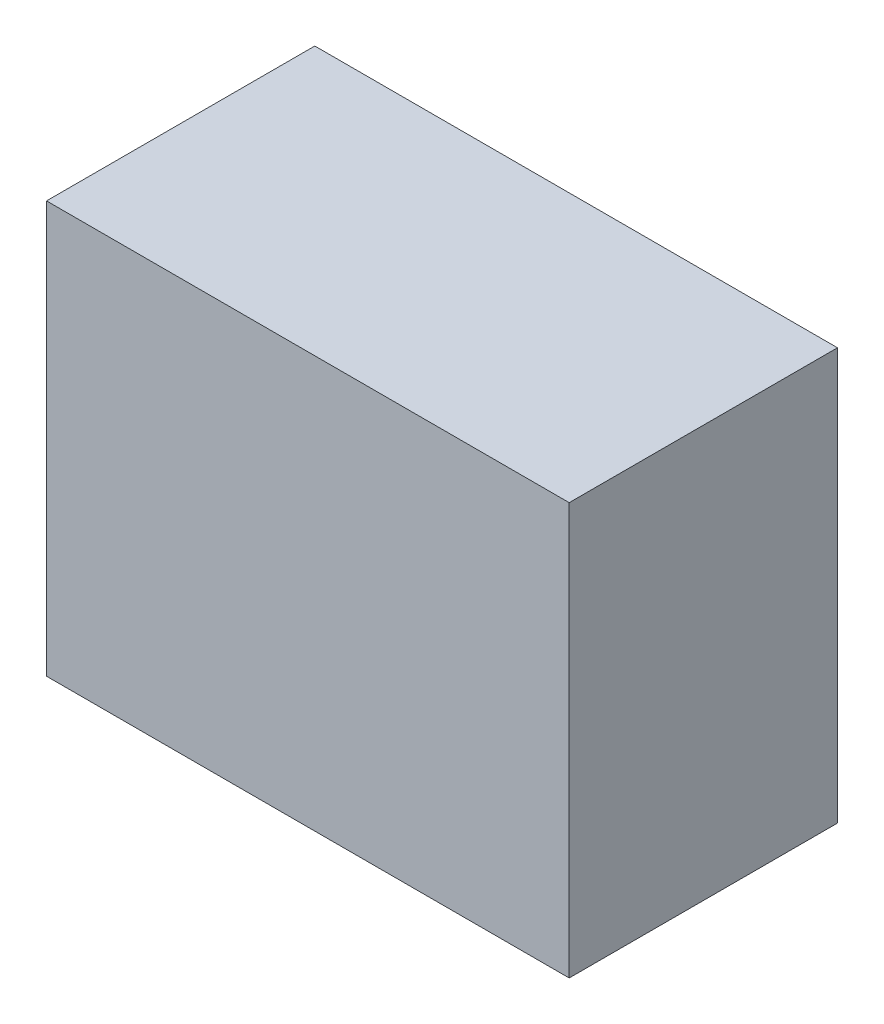
ISO-10303-21;
HEADER;
FILE_DESCRIPTION(('STEP AP214'),'2;1');
FILE_NAME('part.step','',(''),(''),'','','');
FILE_SCHEMA(('AUTOMOTIVE_DESIGN { 1 0 10303 214 1 1 1 1 }'));
ENDSEC;
DATA;
#1=APPLICATION_CONTEXT('core data for automotive mechanical design processes');
#2=APPLICATION_PROTOCOL_DEFINITION('international standard','automotive_design',2000,#1);
#3=PRODUCT_CONTEXT('',#1,'mechanical');
#4=PRODUCT('Part','Part','',(#3));
#5=PRODUCT_RELATED_PRODUCT_CATEGORY('part','',(#4));
#6=PRODUCT_DEFINITION_FORMATION('','',#4);
#7=PRODUCT_DEFINITION_CONTEXT('part definition',#1,'design');
#8=PRODUCT_DEFINITION('design','',#6,#7);
#9=PRODUCT_DEFINITION_SHAPE('','',#8);
#10=(LENGTH_UNIT() NAMED_UNIT(*) SI_UNIT(.MILLI.,.METRE.));
#11=(NAMED_UNIT(*) PLANE_ANGLE_UNIT() SI_UNIT($,.RADIAN.));
#12=(NAMED_UNIT(*) SI_UNIT($,.STERADIAN.) SOLID_ANGLE_UNIT());
#13=UNCERTAINTY_MEASURE_WITH_UNIT(LENGTH_MEASURE(1.E-05),#10,'distance_accuracy_value','');
#14=(GEOMETRIC_REPRESENTATION_CONTEXT(3) GLOBAL_UNCERTAINTY_ASSIGNED_CONTEXT((#13)) GLOBAL_UNIT_ASSIGNED_CONTEXT((#10,
#11,#12)) REPRESENTATION_CONTEXT('',''));
#15=CARTESIAN_POINT('',(0.,0.,0.));
#16=DIRECTION('',(0.,0.,1.));
#17=DIRECTION('',(1.,0.,0.));
#18=AXIS2_PLACEMENT_3D('',#15,#16,#17);
#19=CARTESIAN_POINT('',(-56.5,89.,29.));
#20=DIRECTION('',(-1.,0.,0.));
#21=DIRECTION('',(0.,0.,1.));
#22=AXIS2_PLACEMENT_3D('',#19,#20,#21);
#23=PLANE('',#22);
#24=DIRECTION('',(0.,0.,-1.));
#25=VECTOR('',#24,1.);
#26=CARTESIAN_POINT('',(-56.5,0.,29.));
#27=LINE('',#26,#25);
#28=CARTESIAN_POINT('',(-56.5,0.,29.));
#29=VERTEX_POINT('',#28);
#30=CARTESIAN_POINT('',(-56.5,0.,-29.));
#31=VERTEX_POINT('',#30);
#32=EDGE_CURVE('E116',#29,#31,#27,.T.);
#33=ORIENTED_EDGE('',*,*,#32,.F.);
#34=DIRECTION('',(0.,-1.,0.));
#35=VECTOR('',#34,1.);
#36=CARTESIAN_POINT('',(-56.5,89.,29.));
#37=LINE('',#36,#35);
#38=CARTESIAN_POINT('',(-56.5,89.,29.));
#39=VERTEX_POINT('',#38);
#40=EDGE_CURVE('E11',#39,#29,#37,.T.);
#41=ORIENTED_EDGE('',*,*,#40,.F.);
#42=DIRECTION('',(0.,0.,-1.));
#43=VECTOR('',#42,1.);
#44=CARTESIAN_POINT('',(-56.5,89.,29.));
#45=LINE('',#44,#43);
#46=CARTESIAN_POINT('',(-56.5,89.,-29.));
#47=VERTEX_POINT('',#46);
#48=EDGE_CURVE('E109',#39,#47,#45,.T.);
#49=ORIENTED_EDGE('',*,*,#48,.T.);
#50=DIRECTION('',(0.,-1.,0.));
#51=VECTOR('',#50,1.);
#52=CARTESIAN_POINT('',(-56.5,89.,-29.));
#53=LINE('',#52,#51);
#54=EDGE_CURVE('E48',#47,#31,#53,.T.);
#55=ORIENTED_EDGE('',*,*,#54,.T.);
#56=EDGE_LOOP('',(#33,#41,#49,#55));
#57=FACE_BOUND('',#56,.T.);
#58=ADVANCED_FACE('F45',(#57),#23,.T.);
#59=CARTESIAN_POINT('',(-56.5,89.,29.));
#60=DIRECTION('',(0.,0.,-1.));
#61=DIRECTION('',(-1.,0.,0.));
#62=AXIS2_PLACEMENT_3D('',#59,#60,#61);
#63=PLANE('',#62);
#64=DIRECTION('',(1.,0.,0.));
#65=VECTOR('',#64,1.);
#66=CARTESIAN_POINT('',(-56.5,0.,29.));
#67=LINE('',#66,#65);
#68=CARTESIAN_POINT('',(56.5,0.,29.));
#69=VERTEX_POINT('',#68);
#70=EDGE_CURVE('E79',#29,#69,#67,.T.);
#71=ORIENTED_EDGE('',*,*,#70,.T.);
#72=DIRECTION('',(0.,-1.,0.));
#73=VECTOR('',#72,1.);
#74=CARTESIAN_POINT('',(56.5,89.,29.));
#75=LINE('',#74,#73);
#76=CARTESIAN_POINT('',(56.5,89.,29.));
#77=VERTEX_POINT('',#76);
#78=EDGE_CURVE('E55',#77,#69,#75,.T.);
#79=ORIENTED_EDGE('',*,*,#78,.F.);
#80=DIRECTION('',(1.,0.,0.));
#81=VECTOR('',#80,1.);
#82=CARTESIAN_POINT('',(-56.5,89.,29.));
#83=LINE('',#82,#81);
#84=EDGE_CURVE('E96',#39,#77,#83,.T.);
#85=ORIENTED_EDGE('',*,*,#84,.F.);
#86=ORIENTED_EDGE('',*,*,#40,.T.);
#87=EDGE_LOOP('',(#71,#79,#85,#86));
#88=FACE_BOUND('',#87,.T.);
#89=ADVANCED_FACE('F132',(#88),#63,.F.);
#90=CARTESIAN_POINT('',(56.5,89.,29.));
#91=DIRECTION('',(-1.,0.,0.));
#92=DIRECTION('',(0.,0.,1.));
#93=AXIS2_PLACEMENT_3D('',#90,#91,#92);
#94=PLANE('',#93);
#95=DIRECTION('',(0.,0.,-1.));
#96=VECTOR('',#95,1.);
#97=CARTESIAN_POINT('',(56.5,0.,29.));
#98=LINE('',#97,#96);
#99=CARTESIAN_POINT('',(56.5,0.,-29.));
#100=VERTEX_POINT('',#99);
#101=EDGE_CURVE('E104',#69,#100,#98,.T.);
#102=ORIENTED_EDGE('',*,*,#101,.T.);
#103=DIRECTION('',(0.,-1.,0.));
#104=VECTOR('',#103,1.);
#105=CARTESIAN_POINT('',(56.5,89.,-29.));
#106=LINE('',#105,#104);
#107=CARTESIAN_POINT('',(56.5,89.,-29.));
#108=VERTEX_POINT('',#107);
#109=EDGE_CURVE('E101',#108,#100,#106,.T.);
#110=ORIENTED_EDGE('',*,*,#109,.F.);
#111=DIRECTION('',(0.,0.,-1.));
#112=VECTOR('',#111,1.);
#113=CARTESIAN_POINT('',(56.5,89.,29.));
#114=LINE('',#113,#112);
#115=EDGE_CURVE('E91',#77,#108,#114,.T.);
#116=ORIENTED_EDGE('',*,*,#115,.F.);
#117=ORIENTED_EDGE('',*,*,#78,.T.);
#118=EDGE_LOOP('',(#102,#110,#116,#117));
#119=FACE_BOUND('',#118,.T.);
#120=ADVANCED_FACE('F102',(#119),#94,.F.);
#121=CARTESIAN_POINT('',(-56.5,89.,-29.));
#122=DIRECTION('',(0.,0.,-1.));
#123=DIRECTION('',(-1.,0.,0.));
#124=AXIS2_PLACEMENT_3D('',#121,#122,#123);
#125=PLANE('',#124);
#126=DIRECTION('',(1.,0.,0.));
#127=VECTOR('',#126,1.);
#128=CARTESIAN_POINT('',(-56.5,0.,-29.));
#129=LINE('',#128,#127);
#130=EDGE_CURVE('E120',#31,#100,#129,.T.);
#131=ORIENTED_EDGE('',*,*,#130,.F.);
#132=ORIENTED_EDGE('',*,*,#54,.F.);
#133=DIRECTION('',(1.,0.,0.));
#134=VECTOR('',#133,1.);
#135=CARTESIAN_POINT('',(-56.5,89.,-29.));
#136=LINE('',#135,#134);
#137=EDGE_CURVE('E95',#47,#108,#136,.T.);
#138=ORIENTED_EDGE('',*,*,#137,.T.);
#139=ORIENTED_EDGE('',*,*,#109,.T.);
#140=EDGE_LOOP('',(#131,#132,#138,#139));
#141=FACE_BOUND('',#140,.T.);
#142=ADVANCED_FACE('F107',(#141),#125,.T.);
#143=CARTESIAN_POINT('',(0.,89.,0.));
#144=DIRECTION('',(0.,-1.,0.));
#145=DIRECTION('',(0.,0.,-1.));
#146=AXIS2_PLACEMENT_3D('',#143,#144,#145);
#147=PLANE('',#146);
#148=ORIENTED_EDGE('',*,*,#48,.F.);
#149=ORIENTED_EDGE('',*,*,#84,.T.);
#150=ORIENTED_EDGE('',*,*,#115,.T.);
#151=ORIENTED_EDGE('',*,*,#137,.F.);
#152=EDGE_LOOP('',(#148,#149,#150,#151));
#153=FACE_BOUND('',#152,.T.);
#154=ADVANCED_FACE('F94',(#153),#147,.F.);
#155=CARTESIAN_POINT('',(0.,0.,0.));
#156=DIRECTION('',(0.,-1.,0.));
#157=DIRECTION('',(0.,0.,-1.));
#158=AXIS2_PLACEMENT_3D('',#155,#156,#157);
#159=PLANE('',#158);
#160=ORIENTED_EDGE('',*,*,#32,.T.);
#161=ORIENTED_EDGE('',*,*,#130,.T.);
#162=ORIENTED_EDGE('',*,*,#101,.F.);
#163=ORIENTED_EDGE('',*,*,#70,.F.);
#164=EDGE_LOOP('',(#160,#161,#162,#163));
#165=FACE_BOUND('',#164,.T.);
#166=ADVANCED_FACE('F129',(#165),#159,.T.);
#167=CLOSED_SHELL('',(#58,#89,#120,#142,#154,#166));
#168=MANIFOLD_SOLID_BREP('B2',#167);
#169=ADVANCED_BREP_SHAPE_REPRESENTATION('',(#18,#168),#14);
#170=SHAPE_DEFINITION_REPRESENTATION(#9,#169);
ENDSEC;
END-ISO-10303-21;
